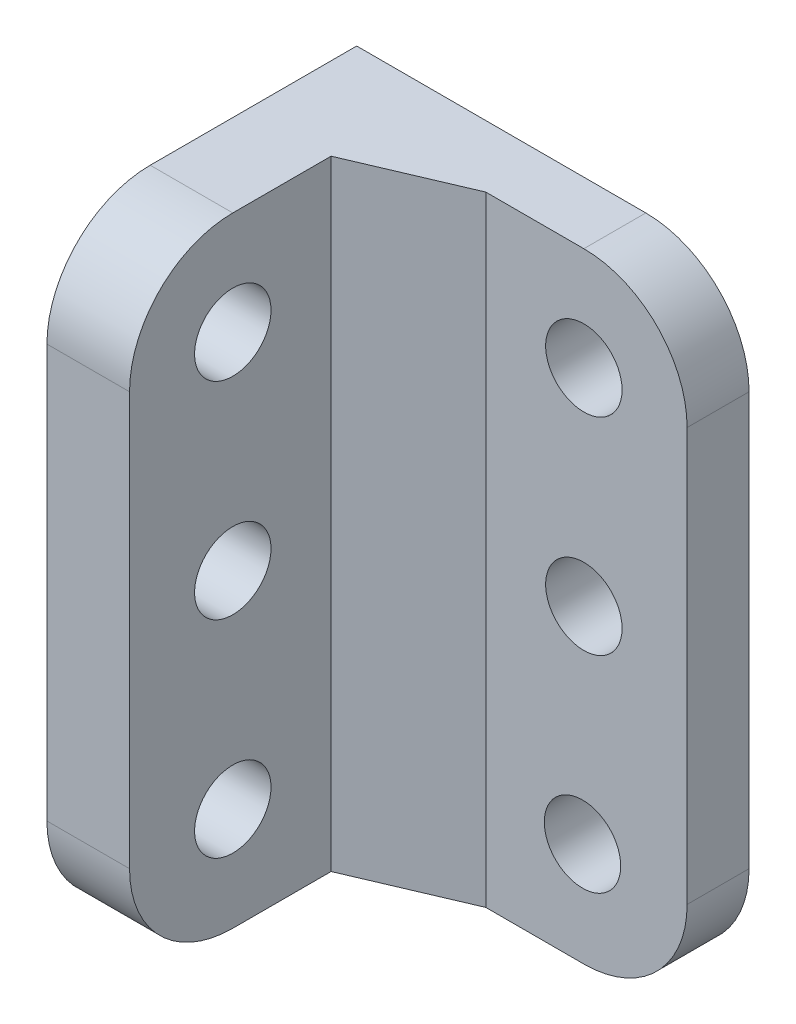
ISO-10303-21;
HEADER;
FILE_DESCRIPTION(('STEP AP214'),'2;1');
FILE_NAME('part.step','',(''),(''),'','','');
FILE_SCHEMA(('AUTOMOTIVE_DESIGN { 1 0 10303 214 1 1 1 1 }'));
ENDSEC;
DATA;
#1=APPLICATION_CONTEXT('core data for automotive mechanical design processes');
#2=APPLICATION_PROTOCOL_DEFINITION('international standard','automotive_design',2000,#1);
#3=PRODUCT_CONTEXT('',#1,'mechanical');
#4=PRODUCT('Part','Part','',(#3));
#5=PRODUCT_RELATED_PRODUCT_CATEGORY('part','',(#4));
#6=PRODUCT_DEFINITION_FORMATION('','',#4);
#7=PRODUCT_DEFINITION_CONTEXT('part definition',#1,'design');
#8=PRODUCT_DEFINITION('design','',#6,#7);
#9=PRODUCT_DEFINITION_SHAPE('','',#8);
#10=(LENGTH_UNIT() NAMED_UNIT(*) SI_UNIT(.MILLI.,.METRE.));
#11=(NAMED_UNIT(*) PLANE_ANGLE_UNIT() SI_UNIT($,.RADIAN.));
#12=(NAMED_UNIT(*) SI_UNIT($,.STERADIAN.) SOLID_ANGLE_UNIT());
#13=UNCERTAINTY_MEASURE_WITH_UNIT(LENGTH_MEASURE(1.E-05),#10,'distance_accuracy_value','');
#14=(GEOMETRIC_REPRESENTATION_CONTEXT(3) GLOBAL_UNCERTAINTY_ASSIGNED_CONTEXT((#13)) GLOBAL_UNIT_ASSIGNED_CONTEXT((#10,
#11,#12)) REPRESENTATION_CONTEXT('',''));
#15=CARTESIAN_POINT('',(0.,0.,0.));
#16=DIRECTION('',(0.,0.,1.));
#17=DIRECTION('',(1.,0.,0.));
#18=AXIS2_PLACEMENT_3D('',#15,#16,#17);
#19=CARTESIAN_POINT('',(0.,38.1,19.05));
#20=DIRECTION('',(1.,0.,0.));
#21=DIRECTION('',(0.,0.,-1.));
#22=AXIS2_PLACEMENT_3D('',#19,#20,#21);
#23=PLANE('',#22);
#24=CARTESIAN_POINT('',(0.,31.75,12.7));
#25=DIRECTION('',(1.,0.,0.));
#26=DIRECTION('',(0.,0.,-1.));
#27=AXIS2_PLACEMENT_3D('',#24,#25,#26);
#28=CIRCLE('',#27,2.3495);
#29=CARTESIAN_POINT('',(0.,31.75,10.3505));
#30=VERTEX_POINT('',#29);
#31=EDGE_CURVE('E295',#30,#30,#28,.T.);
#32=ORIENTED_EDGE('',*,*,#31,.T.);
#33=EDGE_LOOP('',(#32));
#34=FACE_BOUND('',#33,.T.);
#35=CARTESIAN_POINT('',(0.,19.05,12.7));
#36=DIRECTION('',(1.,0.,0.));
#37=DIRECTION('',(0.,0.,-1.));
#38=AXIS2_PLACEMENT_3D('',#35,#36,#37);
#39=CIRCLE('',#38,2.3495);
#40=CARTESIAN_POINT('',(0.,19.05,10.3505));
#41=VERTEX_POINT('',#40);
#42=EDGE_CURVE('E299',#41,#41,#39,.T.);
#43=ORIENTED_EDGE('',*,*,#42,.T.);
#44=EDGE_LOOP('',(#43));
#45=FACE_BOUND('',#44,.T.);
#46=CARTESIAN_POINT('',(0.,6.35000000000001,12.7));
#47=DIRECTION('',(1.,0.,0.));
#48=DIRECTION('',(0.,0.,-1.));
#49=AXIS2_PLACEMENT_3D('',#46,#47,#48);
#50=CIRCLE('',#49,2.3495);
#51=CARTESIAN_POINT('',(0.,6.35000000000001,10.3505));
#52=VERTEX_POINT('',#51);
#53=EDGE_CURVE('E309',#52,#52,#50,.T.);
#54=ORIENTED_EDGE('',*,*,#53,.T.);
#55=EDGE_LOOP('',(#54));
#56=FACE_BOUND('',#55,.T.);
#57=DIRECTION('',(0.,0.,1.));
#58=VECTOR('',#57,1.);
#59=CARTESIAN_POINT('',(0.,0.,19.05));
#60=LINE('',#59,#58);
#61=CARTESIAN_POINT('',(0.,0.,0.));
#62=VERTEX_POINT('',#61);
#63=CARTESIAN_POINT('',(0.,0.,12.7));
#64=VERTEX_POINT('',#63);
#65=EDGE_CURVE('E150',#62,#64,#60,.T.);
#66=ORIENTED_EDGE('',*,*,#65,.T.);
#67=CARTESIAN_POINT('',(0.,6.35,12.7));
#68=DIRECTION('',(1.,0.,0.));
#69=DIRECTION('',(0.,0.,-1.));
#70=AXIS2_PLACEMENT_3D('',#67,#68,#69);
#71=CIRCLE('',#70,6.35);
#72=CARTESIAN_POINT('',(0.,6.35000000000002,19.05));
#73=VERTEX_POINT('',#72);
#74=EDGE_CURVE('E11',#64,#73,#71,.F.);
#75=ORIENTED_EDGE('',*,*,#74,.T.);
#76=DIRECTION('',(0.,-1.,0.));
#77=VECTOR('',#76,1.);
#78=CARTESIAN_POINT('',(0.,38.1,19.05));
#79=LINE('',#78,#77);
#80=CARTESIAN_POINT('',(0.,31.75,19.05));
#81=VERTEX_POINT('',#80);
#82=EDGE_CURVE('E171',#81,#73,#79,.T.);
#83=ORIENTED_EDGE('',*,*,#82,.F.);
#84=CARTESIAN_POINT('',(0.,31.75,12.7));
#85=DIRECTION('',(1.,0.,0.));
#86=DIRECTION('',(0.,0.,-1.));
#87=AXIS2_PLACEMENT_3D('',#84,#85,#86);
#88=CIRCLE('',#87,6.35);
#89=CARTESIAN_POINT('',(0.,38.1,12.7));
#90=VERTEX_POINT('',#89);
#91=EDGE_CURVE('E40',#81,#90,#88,.F.);
#92=ORIENTED_EDGE('',*,*,#91,.T.);
#93=DIRECTION('',(0.,0.,1.));
#94=VECTOR('',#93,1.);
#95=CARTESIAN_POINT('',(0.,38.1,19.05));
#96=LINE('',#95,#94);
#97=CARTESIAN_POINT('',(0.,38.1,0.));
#98=VERTEX_POINT('',#97);
#99=EDGE_CURVE('E126',#98,#90,#96,.T.);
#100=ORIENTED_EDGE('',*,*,#99,.F.);
#101=DIRECTION('',(0.,-1.,0.));
#102=VECTOR('',#101,1.);
#103=CARTESIAN_POINT('',(0.,38.1,0.));
#104=LINE('',#103,#102);
#105=EDGE_CURVE('E149',#98,#62,#104,.T.);
#106=ORIENTED_EDGE('',*,*,#105,.T.);
#107=EDGE_LOOP('',(#66,#75,#83,#92,#100,#106));
#108=FACE_BOUND('',#107,.T.);
#109=ADVANCED_FACE('F32',(#34,#45,#56,#108),#23,.F.);
#110=CARTESIAN_POINT('',(5.08,38.1,19.05));
#111=DIRECTION('',(0.,0.,-1.));
#112=DIRECTION('',(-1.,0.,0.));
#113=AXIS2_PLACEMENT_3D('',#110,#111,#112);
#114=PLANE('',#113);
#115=ORIENTED_EDGE('',*,*,#82,.T.);
#116=DIRECTION('',(1.,0.,0.));
#117=VECTOR('',#116,1.);
#118=CARTESIAN_POINT('',(5.08,6.35,19.05));
#119=LINE('',#118,#117);
#120=CARTESIAN_POINT('',(5.08,6.35000000000002,19.05));
#121=VERTEX_POINT('',#120);
#122=EDGE_CURVE('E195',#73,#121,#119,.T.);
#123=ORIENTED_EDGE('',*,*,#122,.T.);
#124=DIRECTION('',(0.,-1.,0.));
#125=VECTOR('',#124,1.);
#126=CARTESIAN_POINT('',(5.08,38.1,19.05));
#127=LINE('',#126,#125);
#128=CARTESIAN_POINT('',(5.08,31.75,19.05));
#129=VERTEX_POINT('',#128);
#130=EDGE_CURVE('E136',#129,#121,#127,.T.);
#131=ORIENTED_EDGE('',*,*,#130,.F.);
#132=DIRECTION('',(1.,0.,0.));
#133=VECTOR('',#132,1.);
#134=CARTESIAN_POINT('',(5.08,31.75,19.05));
#135=LINE('',#134,#133);
#136=EDGE_CURVE('E52',#129,#81,#135,.F.);
#137=ORIENTED_EDGE('',*,*,#136,.T.);
#138=EDGE_LOOP('',(#115,#123,#131,#137));
#139=FACE_BOUND('',#138,.T.);
#140=ADVANCED_FACE('F206',(#139),#114,.F.);
#141=CARTESIAN_POINT('',(5.08,38.1,6.6548));
#142=DIRECTION('',(-1.,0.,0.));
#143=DIRECTION('',(0.,0.,1.));
#144=AXIS2_PLACEMENT_3D('',#141,#142,#143);
#145=PLANE('',#144);
#146=CARTESIAN_POINT('',(5.08,31.75,12.7));
#147=DIRECTION('',(1.,0.,0.));
#148=DIRECTION('',(0.,0.,-1.));
#149=AXIS2_PLACEMENT_3D('',#146,#147,#148);
#150=CIRCLE('',#149,2.3495);
#151=CARTESIAN_POINT('',(5.08,31.75,10.3505));
#152=VERTEX_POINT('',#151);
#153=EDGE_CURVE('E298',#152,#152,#150,.T.);
#154=ORIENTED_EDGE('',*,*,#153,.F.);
#155=EDGE_LOOP('',(#154));
#156=FACE_BOUND('',#155,.T.);
#157=CARTESIAN_POINT('',(5.08,19.05,12.7));
#158=DIRECTION('',(1.,0.,0.));
#159=DIRECTION('',(0.,0.,-1.));
#160=AXIS2_PLACEMENT_3D('',#157,#158,#159);
#161=CIRCLE('',#160,2.3495);
#162=CARTESIAN_POINT('',(5.08,19.05,10.3505));
#163=VERTEX_POINT('',#162);
#164=EDGE_CURVE('E304',#163,#163,#161,.T.);
#165=ORIENTED_EDGE('',*,*,#164,.F.);
#166=EDGE_LOOP('',(#165));
#167=FACE_BOUND('',#166,.T.);
#168=CARTESIAN_POINT('',(5.08,6.35000000000001,12.7));
#169=DIRECTION('',(1.,0.,0.));
#170=DIRECTION('',(0.,0.,-1.));
#171=AXIS2_PLACEMENT_3D('',#168,#169,#170);
#172=CIRCLE('',#171,2.3495);
#173=CARTESIAN_POINT('',(5.08,6.35000000000001,10.3505));
#174=VERTEX_POINT('',#173);
#175=EDGE_CURVE('E312',#174,#174,#172,.T.);
#176=ORIENTED_EDGE('',*,*,#175,.F.);
#177=EDGE_LOOP('',(#176));
#178=FACE_BOUND('',#177,.T.);
#179=ORIENTED_EDGE('',*,*,#130,.T.);
#180=CARTESIAN_POINT('',(5.08,6.35,12.7));
#181=DIRECTION('',(-1.,0.,0.));
#182=DIRECTION('',(0.,0.,1.));
#183=AXIS2_PLACEMENT_3D('',#180,#181,#182);
#184=CIRCLE('',#183,6.35);
#185=CARTESIAN_POINT('',(5.08,0.,12.7));
#186=VERTEX_POINT('',#185);
#187=EDGE_CURVE('E200',#121,#186,#184,.F.);
#188=ORIENTED_EDGE('',*,*,#187,.T.);
#189=DIRECTION('',(0.,0.,-1.));
#190=VECTOR('',#189,1.);
#191=CARTESIAN_POINT('',(5.08,0.,6.6548));
#192=LINE('',#191,#190);
#193=CARTESIAN_POINT('',(5.08,0.,6.6548));
#194=VERTEX_POINT('',#193);
#195=EDGE_CURVE('E133',#186,#194,#192,.T.);
#196=ORIENTED_EDGE('',*,*,#195,.T.);
#197=DIRECTION('',(0.,-1.,0.));
#198=VECTOR('',#197,1.);
#199=CARTESIAN_POINT('',(5.08,38.1,6.6548));
#200=LINE('',#199,#198);
#201=CARTESIAN_POINT('',(5.08,38.1,6.6548));
#202=VERTEX_POINT('',#201);
#203=EDGE_CURVE('E129',#202,#194,#200,.T.);
#204=ORIENTED_EDGE('',*,*,#203,.F.);
#205=DIRECTION('',(0.,0.,-1.));
#206=VECTOR('',#205,1.);
#207=CARTESIAN_POINT('',(5.08,38.1,6.6548));
#208=LINE('',#207,#206);
#209=CARTESIAN_POINT('',(5.08,38.1,12.7));
#210=VERTEX_POINT('',#209);
#211=EDGE_CURVE('E115',#210,#202,#208,.T.);
#212=ORIENTED_EDGE('',*,*,#211,.F.);
#213=CARTESIAN_POINT('',(5.08,31.75,12.7));
#214=DIRECTION('',(-1.,0.,0.));
#215=DIRECTION('',(0.,0.,1.));
#216=AXIS2_PLACEMENT_3D('',#213,#214,#215);
#217=CIRCLE('',#216,6.35);
#218=EDGE_CURVE('E198',#210,#129,#217,.F.);
#219=ORIENTED_EDGE('',*,*,#218,.T.);
#220=EDGE_LOOP('',(#179,#188,#196,#204,#212,#219));
#221=FACE_BOUND('',#220,.T.);
#222=ADVANCED_FACE('F131',(#156,#167,#178,#221),#145,.F.);
#223=CARTESIAN_POINT('',(11.7475,38.1,3.81));
#224=DIRECTION('',(-0.392438685047784,0.,-0.919778168080742));
#225=DIRECTION('',(-0.919778168080743,0.,0.392438685047784));
#226=AXIS2_PLACEMENT_3D('',#223,#224,#225);
#227=PLANE('',#226);
#228=DIRECTION('',(0.919778168080743,0.,-0.392438685047784));
#229=VECTOR('',#228,1.);
#230=CARTESIAN_POINT('',(11.7475,0.,3.81));
#231=LINE('',#230,#229);
#232=CARTESIAN_POINT('',(11.7475,0.,3.81));
#233=VERTEX_POINT('',#232);
#234=EDGE_CURVE('E154',#194,#233,#231,.T.);
#235=ORIENTED_EDGE('',*,*,#234,.T.);
#236=DIRECTION('',(0.,-1.,0.));
#237=VECTOR('',#236,1.);
#238=CARTESIAN_POINT('',(11.7475,38.1,3.81));
#239=LINE('',#238,#237);
#240=CARTESIAN_POINT('',(11.7475,38.1,3.81));
#241=VERTEX_POINT('',#240);
#242=EDGE_CURVE('E137',#241,#233,#239,.T.);
#243=ORIENTED_EDGE('',*,*,#242,.F.);
#244=DIRECTION('',(0.919778168080743,0.,-0.392438685047784));
#245=VECTOR('',#244,1.);
#246=CARTESIAN_POINT('',(11.7475,38.1,3.81));
#247=LINE('',#246,#245);
#248=EDGE_CURVE('E120',#202,#241,#247,.T.);
#249=ORIENTED_EDGE('',*,*,#248,.F.);
#250=ORIENTED_EDGE('',*,*,#203,.T.);
#251=EDGE_LOOP('',(#235,#243,#249,#250));
#252=FACE_BOUND('',#251,.T.);
#253=ADVANCED_FACE('F139',(#252),#227,.F.);
#254=CARTESIAN_POINT('',(24.13,38.1,3.81));
#255=DIRECTION('',(0.,0.,-1.));
#256=DIRECTION('',(-1.,0.,0.));
#257=AXIS2_PLACEMENT_3D('',#254,#255,#256);
#258=PLANE('',#257);
#259=CARTESIAN_POINT('',(17.6973232323232,6.35000000000001,3.81));
#260=DIRECTION('',(0.,0.,1.));
#261=DIRECTION('',(1.,0.,0.));
#262=AXIS2_PLACEMENT_3D('',#259,#260,#261);
#263=CIRCLE('',#262,2.3495);
#264=CARTESIAN_POINT('',(20.0468232323232,6.35000000000001,3.81));
#265=VERTEX_POINT('',#264);
#266=EDGE_CURVE('E317',#265,#265,#263,.T.);
#267=ORIENTED_EDGE('',*,*,#266,.F.);
#268=EDGE_LOOP('',(#267));
#269=FACE_BOUND('',#268,.T.);
#270=CARTESIAN_POINT('',(17.78,19.05,3.81));
#271=DIRECTION('',(0.,0.,1.));
#272=DIRECTION('',(1.,0.,0.));
#273=AXIS2_PLACEMENT_3D('',#270,#271,#272);
#274=CIRCLE('',#273,2.3495);
#275=CARTESIAN_POINT('',(20.1295,19.05,3.81));
#276=VERTEX_POINT('',#275);
#277=EDGE_CURVE('E323',#276,#276,#274,.T.);
#278=ORIENTED_EDGE('',*,*,#277,.F.);
#279=EDGE_LOOP('',(#278));
#280=FACE_BOUND('',#279,.T.);
#281=CARTESIAN_POINT('',(17.78,31.75,3.81));
#282=DIRECTION('',(0.,0.,1.));
#283=DIRECTION('',(1.,0.,0.));
#284=AXIS2_PLACEMENT_3D('',#281,#282,#283);
#285=CIRCLE('',#284,2.3495);
#286=CARTESIAN_POINT('',(20.1295,31.75,3.81));
#287=VERTEX_POINT('',#286);
#288=EDGE_CURVE('E301',#287,#287,#285,.T.);
#289=ORIENTED_EDGE('',*,*,#288,.F.);
#290=EDGE_LOOP('',(#289));
#291=FACE_BOUND('',#290,.T.);
#292=DIRECTION('',(0.,-1.,0.));
#293=VECTOR('',#292,1.);
#294=CARTESIAN_POINT('',(24.13,38.1,3.81));
#295=LINE('',#294,#293);
#296=CARTESIAN_POINT('',(24.13,31.75,3.81));
#297=VERTEX_POINT('',#296);
#298=CARTESIAN_POINT('',(24.13,6.35000000000002,3.81));
#299=VERTEX_POINT('',#298);
#300=EDGE_CURVE('E166',#297,#299,#295,.T.);
#301=ORIENTED_EDGE('',*,*,#300,.F.);
#302=CARTESIAN_POINT('',(17.78,31.75,3.81));
#303=DIRECTION('',(0.,0.,-1.));
#304=DIRECTION('',(-1.,0.,0.));
#305=AXIS2_PLACEMENT_3D('',#302,#303,#304);
#306=CIRCLE('',#305,6.35);
#307=CARTESIAN_POINT('',(17.78,38.1,3.81));
#308=VERTEX_POINT('',#307);
#309=EDGE_CURVE('E188',#297,#308,#306,.F.);
#310=ORIENTED_EDGE('',*,*,#309,.T.);
#311=DIRECTION('',(1.,0.,0.));
#312=VECTOR('',#311,1.);
#313=CARTESIAN_POINT('',(24.13,38.1,3.81));
#314=LINE('',#313,#312);
#315=EDGE_CURVE('E142',#241,#308,#314,.T.);
#316=ORIENTED_EDGE('',*,*,#315,.F.);
#317=ORIENTED_EDGE('',*,*,#242,.T.);
#318=DIRECTION('',(1.,0.,0.));
#319=VECTOR('',#318,1.);
#320=CARTESIAN_POINT('',(24.13,0.,3.81));
#321=LINE('',#320,#319);
#322=CARTESIAN_POINT('',(17.78,0.,3.81));
#323=VERTEX_POINT('',#322);
#324=EDGE_CURVE('E156',#233,#323,#321,.T.);
#325=ORIENTED_EDGE('',*,*,#324,.T.);
#326=CARTESIAN_POINT('',(17.78,6.35,3.81));
#327=DIRECTION('',(0.,0.,-1.));
#328=DIRECTION('',(-1.,0.,0.));
#329=AXIS2_PLACEMENT_3D('',#326,#327,#328);
#330=CIRCLE('',#329,6.35);
#331=EDGE_CURVE('E186',#323,#299,#330,.F.);
#332=ORIENTED_EDGE('',*,*,#331,.T.);
#333=EDGE_LOOP('',(#301,#310,#316,#317,#325,#332));
#334=FACE_BOUND('',#333,.T.);
#335=ADVANCED_FACE('F218',(#269,#280,#291,#334),#258,.F.);
#336=CARTESIAN_POINT('',(24.13,38.1,0.));
#337=DIRECTION('',(-1.,0.,0.));
#338=DIRECTION('',(0.,0.,1.));
#339=AXIS2_PLACEMENT_3D('',#336,#337,#338);
#340=PLANE('',#339);
#341=DIRECTION('',(0.,-1.,0.));
#342=VECTOR('',#341,1.);
#343=CARTESIAN_POINT('',(24.13,38.1,0.));
#344=LINE('',#343,#342);
#345=CARTESIAN_POINT('',(24.13,31.75,0.));
#346=VERTEX_POINT('',#345);
#347=CARTESIAN_POINT('',(24.13,6.35000000000002,0.));
#348=VERTEX_POINT('',#347);
#349=EDGE_CURVE('E163',#346,#348,#344,.T.);
#350=ORIENTED_EDGE('',*,*,#349,.F.);
#351=DIRECTION('',(0.,0.,-1.));
#352=VECTOR('',#351,1.);
#353=CARTESIAN_POINT('',(24.13,31.75,0.));
#354=LINE('',#353,#352);
#355=EDGE_CURVE('E184',#346,#297,#354,.F.);
#356=ORIENTED_EDGE('',*,*,#355,.T.);
#357=ORIENTED_EDGE('',*,*,#300,.T.);
#358=DIRECTION('',(0.,0.,-1.));
#359=VECTOR('',#358,1.);
#360=CARTESIAN_POINT('',(24.13,6.35,0.));
#361=LINE('',#360,#359);
#362=EDGE_CURVE('E181',#299,#348,#361,.T.);
#363=ORIENTED_EDGE('',*,*,#362,.T.);
#364=EDGE_LOOP('',(#350,#356,#357,#363));
#365=FACE_BOUND('',#364,.T.);
#366=ADVANCED_FACE('F229',(#365),#340,.F.);
#367=CARTESIAN_POINT('',(0.,38.1,0.));
#368=DIRECTION('',(0.,0.,1.));
#369=DIRECTION('',(1.,0.,0.));
#370=AXIS2_PLACEMENT_3D('',#367,#368,#369);
#371=PLANE('',#370);
#372=CARTESIAN_POINT('',(17.6973232323232,6.35000000000001,0.));
#373=DIRECTION('',(0.,0.,1.));
#374=DIRECTION('',(1.,0.,0.));
#375=AXIS2_PLACEMENT_3D('',#372,#373,#374);
#376=CIRCLE('',#375,2.3495);
#377=CARTESIAN_POINT('',(20.0468232323232,6.35000000000001,0.));
#378=VERTEX_POINT('',#377);
#379=EDGE_CURVE('E152',#378,#378,#376,.T.);
#380=ORIENTED_EDGE('',*,*,#379,.T.);
#381=EDGE_LOOP('',(#380));
#382=FACE_BOUND('',#381,.T.);
#383=CARTESIAN_POINT('',(17.78,19.05,0.));
#384=DIRECTION('',(0.,0.,1.));
#385=DIRECTION('',(1.,0.,0.));
#386=AXIS2_PLACEMENT_3D('',#383,#384,#385);
#387=CIRCLE('',#386,2.3495);
#388=CARTESIAN_POINT('',(20.1295,19.05,0.));
#389=VERTEX_POINT('',#388);
#390=EDGE_CURVE('E320',#389,#389,#387,.T.);
#391=ORIENTED_EDGE('',*,*,#390,.T.);
#392=EDGE_LOOP('',(#391));
#393=FACE_BOUND('',#392,.T.);
#394=CARTESIAN_POINT('',(17.78,31.75,0.));
#395=DIRECTION('',(0.,0.,1.));
#396=DIRECTION('',(1.,0.,0.));
#397=AXIS2_PLACEMENT_3D('',#394,#395,#396);
#398=CIRCLE('',#397,2.3495);
#399=CARTESIAN_POINT('',(20.1295,31.75,0.));
#400=VERTEX_POINT('',#399);
#401=EDGE_CURVE('E326',#400,#400,#398,.T.);
#402=ORIENTED_EDGE('',*,*,#401,.T.);
#403=EDGE_LOOP('',(#402));
#404=FACE_BOUND('',#403,.T.);
#405=DIRECTION('',(-1.,0.,0.));
#406=VECTOR('',#405,1.);
#407=CARTESIAN_POINT('',(0.,38.1,0.));
#408=LINE('',#407,#406);
#409=CARTESIAN_POINT('',(17.78,38.1,0.));
#410=VERTEX_POINT('',#409);
#411=EDGE_CURVE('E144',#410,#98,#408,.T.);
#412=ORIENTED_EDGE('',*,*,#411,.F.);
#413=CARTESIAN_POINT('',(17.78,31.75,0.));
#414=DIRECTION('',(0.,0.,1.));
#415=DIRECTION('',(1.,0.,0.));
#416=AXIS2_PLACEMENT_3D('',#413,#414,#415);
#417=CIRCLE('',#416,6.35);
#418=EDGE_CURVE('E179',#410,#346,#417,.F.);
#419=ORIENTED_EDGE('',*,*,#418,.T.);
#420=ORIENTED_EDGE('',*,*,#349,.T.);
#421=CARTESIAN_POINT('',(17.78,6.35,0.));
#422=DIRECTION('',(0.,0.,1.));
#423=DIRECTION('',(1.,0.,0.));
#424=AXIS2_PLACEMENT_3D('',#421,#422,#423);
#425=CIRCLE('',#424,6.35);
#426=CARTESIAN_POINT('',(17.78,0.,0.));
#427=VERTEX_POINT('',#426);
#428=EDGE_CURVE('E177',#348,#427,#425,.F.);
#429=ORIENTED_EDGE('',*,*,#428,.T.);
#430=DIRECTION('',(-1.,0.,0.));
#431=VECTOR('',#430,1.);
#432=CARTESIAN_POINT('',(0.,0.,0.));
#433=LINE('',#432,#431);
#434=EDGE_CURVE('E159',#427,#62,#433,.T.);
#435=ORIENTED_EDGE('',*,*,#434,.T.);
#436=ORIENTED_EDGE('',*,*,#105,.F.);
#437=EDGE_LOOP('',(#412,#419,#420,#429,#435,#436));
#438=FACE_BOUND('',#437,.T.);
#439=ADVANCED_FACE('F227',(#382,#393,#404,#438),#371,.F.);
#440=CARTESIAN_POINT('',(0.,38.1,0.));
#441=DIRECTION('',(0.,-1.,0.));
#442=DIRECTION('',(0.,0.,-1.));
#443=AXIS2_PLACEMENT_3D('',#440,#441,#442);
#444=PLANE('',#443);
#445=ORIENTED_EDGE('',*,*,#315,.T.);
#446=DIRECTION('',(0.,0.,-1.));
#447=VECTOR('',#446,1.);
#448=CARTESIAN_POINT('',(17.78,38.1,0.));
#449=LINE('',#448,#447);
#450=EDGE_CURVE('E174',#308,#410,#449,.T.);
#451=ORIENTED_EDGE('',*,*,#450,.T.);
#452=ORIENTED_EDGE('',*,*,#411,.T.);
#453=ORIENTED_EDGE('',*,*,#99,.T.);
#454=DIRECTION('',(1.,0.,0.));
#455=VECTOR('',#454,1.);
#456=CARTESIAN_POINT('',(0.,38.1,12.7));
#457=LINE('',#456,#455);
#458=EDGE_CURVE('E124',#90,#210,#457,.T.);
#459=ORIENTED_EDGE('',*,*,#458,.T.);
#460=ORIENTED_EDGE('',*,*,#211,.T.);
#461=ORIENTED_EDGE('',*,*,#248,.T.);
#462=EDGE_LOOP('',(#445,#451,#452,#453,#459,#460,#461));
#463=FACE_BOUND('',#462,.T.);
#464=ADVANCED_FACE('F118',(#463),#444,.F.);
#465=CARTESIAN_POINT('',(0.,0.,0.));
#466=DIRECTION('',(0.,-1.,0.));
#467=DIRECTION('',(0.,0.,-1.));
#468=AXIS2_PLACEMENT_3D('',#465,#466,#467);
#469=PLANE('',#468);
#470=ORIENTED_EDGE('',*,*,#434,.F.);
#471=DIRECTION('',(0.,0.,-1.));
#472=VECTOR('',#471,1.);
#473=CARTESIAN_POINT('',(17.78,0.,3.81));
#474=LINE('',#473,#472);
#475=EDGE_CURVE('E192',#427,#323,#474,.F.);
#476=ORIENTED_EDGE('',*,*,#475,.T.);
#477=ORIENTED_EDGE('',*,*,#324,.F.);
#478=ORIENTED_EDGE('',*,*,#234,.F.);
#479=ORIENTED_EDGE('',*,*,#195,.F.);
#480=DIRECTION('',(1.,0.,0.));
#481=VECTOR('',#480,1.);
#482=CARTESIAN_POINT('',(0.,0.,12.7));
#483=LINE('',#482,#481);
#484=EDGE_CURVE('E190',#186,#64,#483,.F.);
#485=ORIENTED_EDGE('',*,*,#484,.T.);
#486=ORIENTED_EDGE('',*,*,#65,.F.);
#487=EDGE_LOOP('',(#470,#476,#477,#478,#479,#485,#486));
#488=FACE_BOUND('',#487,.T.);
#489=ADVANCED_FACE('F213',(#488),#469,.T.);
#490=CARTESIAN_POINT('',(17.78,31.75,0.));
#491=DIRECTION('',(0.,0.,1.));
#492=DIRECTION('',(1.,0.,0.));
#493=AXIS2_PLACEMENT_3D('',#490,#491,#492);
#494=CYLINDRICAL_SURFACE('',#493,2.3495);
#495=ORIENTED_EDGE('',*,*,#401,.F.);
#496=EDGE_LOOP('',(#495));
#497=FACE_BOUND('',#496,.T.);
#498=ORIENTED_EDGE('',*,*,#288,.T.);
#499=EDGE_LOOP('',(#498));
#500=FACE_BOUND('',#499,.T.);
#501=ADVANCED_FACE('F267',(#497,#500),#494,.F.);
#502=CARTESIAN_POINT('',(17.78,19.05,0.));
#503=DIRECTION('',(0.,0.,1.));
#504=DIRECTION('',(1.,0.,0.));
#505=AXIS2_PLACEMENT_3D('',#502,#503,#504);
#506=CYLINDRICAL_SURFACE('',#505,2.3495);
#507=ORIENTED_EDGE('',*,*,#390,.F.);
#508=EDGE_LOOP('',(#507));
#509=FACE_BOUND('',#508,.T.);
#510=ORIENTED_EDGE('',*,*,#277,.T.);
#511=EDGE_LOOP('',(#510));
#512=FACE_BOUND('',#511,.T.);
#513=ADVANCED_FACE('F272',(#509,#512),#506,.F.);
#514=CARTESIAN_POINT('',(17.6973232323232,6.35000000000001,0.));
#515=DIRECTION('',(0.,0.,1.));
#516=DIRECTION('',(1.,0.,0.));
#517=AXIS2_PLACEMENT_3D('',#514,#515,#516);
#518=CYLINDRICAL_SURFACE('',#517,2.3495);
#519=ORIENTED_EDGE('',*,*,#379,.F.);
#520=EDGE_LOOP('',(#519));
#521=FACE_BOUND('',#520,.T.);
#522=ORIENTED_EDGE('',*,*,#266,.T.);
#523=EDGE_LOOP('',(#522));
#524=FACE_BOUND('',#523,.T.);
#525=ADVANCED_FACE('F276',(#521,#524),#518,.F.);
#526=CARTESIAN_POINT('',(0.,6.35000000000001,12.7));
#527=DIRECTION('',(1.,0.,0.));
#528=DIRECTION('',(0.,0.,-1.));
#529=AXIS2_PLACEMENT_3D('',#526,#527,#528);
#530=CYLINDRICAL_SURFACE('',#529,2.3495);
#531=ORIENTED_EDGE('',*,*,#53,.F.);
#532=EDGE_LOOP('',(#531));
#533=FACE_BOUND('',#532,.T.);
#534=ORIENTED_EDGE('',*,*,#175,.T.);
#535=EDGE_LOOP('',(#534));
#536=FACE_BOUND('',#535,.T.);
#537=ADVANCED_FACE('F280',(#533,#536),#530,.F.);
#538=CARTESIAN_POINT('',(0.,19.05,12.7));
#539=DIRECTION('',(1.,0.,0.));
#540=DIRECTION('',(0.,0.,-1.));
#541=AXIS2_PLACEMENT_3D('',#538,#539,#540);
#542=CYLINDRICAL_SURFACE('',#541,2.3495);
#543=ORIENTED_EDGE('',*,*,#42,.F.);
#544=EDGE_LOOP('',(#543));
#545=FACE_BOUND('',#544,.T.);
#546=ORIENTED_EDGE('',*,*,#164,.T.);
#547=EDGE_LOOP('',(#546));
#548=FACE_BOUND('',#547,.T.);
#549=ADVANCED_FACE('F284',(#545,#548),#542,.F.);
#550=CARTESIAN_POINT('',(0.,31.75,12.7));
#551=DIRECTION('',(1.,0.,0.));
#552=DIRECTION('',(0.,0.,-1.));
#553=AXIS2_PLACEMENT_3D('',#550,#551,#552);
#554=CYLINDRICAL_SURFACE('',#553,2.3495);
#555=ORIENTED_EDGE('',*,*,#31,.F.);
#556=EDGE_LOOP('',(#555));
#557=FACE_BOUND('',#556,.T.);
#558=ORIENTED_EDGE('',*,*,#153,.T.);
#559=EDGE_LOOP('',(#558));
#560=FACE_BOUND('',#559,.T.);
#561=ADVANCED_FACE('F240',(#557,#560),#554,.F.);
#562=CARTESIAN_POINT('',(17.78,31.75,0.));
#563=DIRECTION('',(0.,0.,-1.));
#564=DIRECTION('',(-1.,0.,0.));
#565=AXIS2_PLACEMENT_3D('',#562,#563,#564);
#566=CYLINDRICAL_SURFACE('',#565,6.35);
#567=ORIENTED_EDGE('',*,*,#309,.F.);
#568=ORIENTED_EDGE('',*,*,#355,.F.);
#569=ORIENTED_EDGE('',*,*,#418,.F.);
#570=ORIENTED_EDGE('',*,*,#450,.F.);
#571=EDGE_LOOP('',(#567,#568,#569,#570));
#572=FACE_BOUND('',#571,.T.);
#573=ADVANCED_FACE('F223',(#572),#566,.T.);
#574=CARTESIAN_POINT('',(17.78,6.35,0.));
#575=DIRECTION('',(0.,0.,1.));
#576=DIRECTION('',(1.,0.,0.));
#577=AXIS2_PLACEMENT_3D('',#574,#575,#576);
#578=CYLINDRICAL_SURFACE('',#577,6.35);
#579=ORIENTED_EDGE('',*,*,#331,.F.);
#580=ORIENTED_EDGE('',*,*,#475,.F.);
#581=ORIENTED_EDGE('',*,*,#428,.F.);
#582=ORIENTED_EDGE('',*,*,#362,.F.);
#583=EDGE_LOOP('',(#579,#580,#581,#582));
#584=FACE_BOUND('',#583,.T.);
#585=ADVANCED_FACE('F232',(#584),#578,.T.);
#586=CARTESIAN_POINT('',(5.08,6.35,12.7));
#587=DIRECTION('',(-1.,0.,0.));
#588=DIRECTION('',(0.,0.,1.));
#589=AXIS2_PLACEMENT_3D('',#586,#587,#588);
#590=CYLINDRICAL_SURFACE('',#589,6.35);
#591=ORIENTED_EDGE('',*,*,#74,.F.);
#592=ORIENTED_EDGE('',*,*,#484,.F.);
#593=ORIENTED_EDGE('',*,*,#187,.F.);
#594=ORIENTED_EDGE('',*,*,#122,.F.);
#595=EDGE_LOOP('',(#591,#592,#593,#594));
#596=FACE_BOUND('',#595,.T.);
#597=ADVANCED_FACE('F209',(#596),#590,.T.);
#598=CARTESIAN_POINT('',(0.,31.75,12.7));
#599=DIRECTION('',(1.,0.,0.));
#600=DIRECTION('',(0.,0.,-1.));
#601=AXIS2_PLACEMENT_3D('',#598,#599,#600);
#602=CYLINDRICAL_SURFACE('',#601,6.35);
#603=ORIENTED_EDGE('',*,*,#91,.F.);
#604=ORIENTED_EDGE('',*,*,#136,.F.);
#605=ORIENTED_EDGE('',*,*,#218,.F.);
#606=ORIENTED_EDGE('',*,*,#458,.F.);
#607=EDGE_LOOP('',(#603,#604,#605,#606));
#608=FACE_BOUND('',#607,.T.);
#609=ADVANCED_FACE('F34',(#608),#602,.T.);
#610=CLOSED_SHELL('',(#109,#140,#222,#253,#335,#366,#439,#464,#489,#501,#513,#525,#537,#549,
#561,#573,#585,#597,#609));
#611=MANIFOLD_SOLID_BREP('B2',#610);
#612=ADVANCED_BREP_SHAPE_REPRESENTATION('',(#18,#611),#14);
#613=SHAPE_DEFINITION_REPRESENTATION(#9,#612);
ENDSEC;
END-ISO-10303-21;
